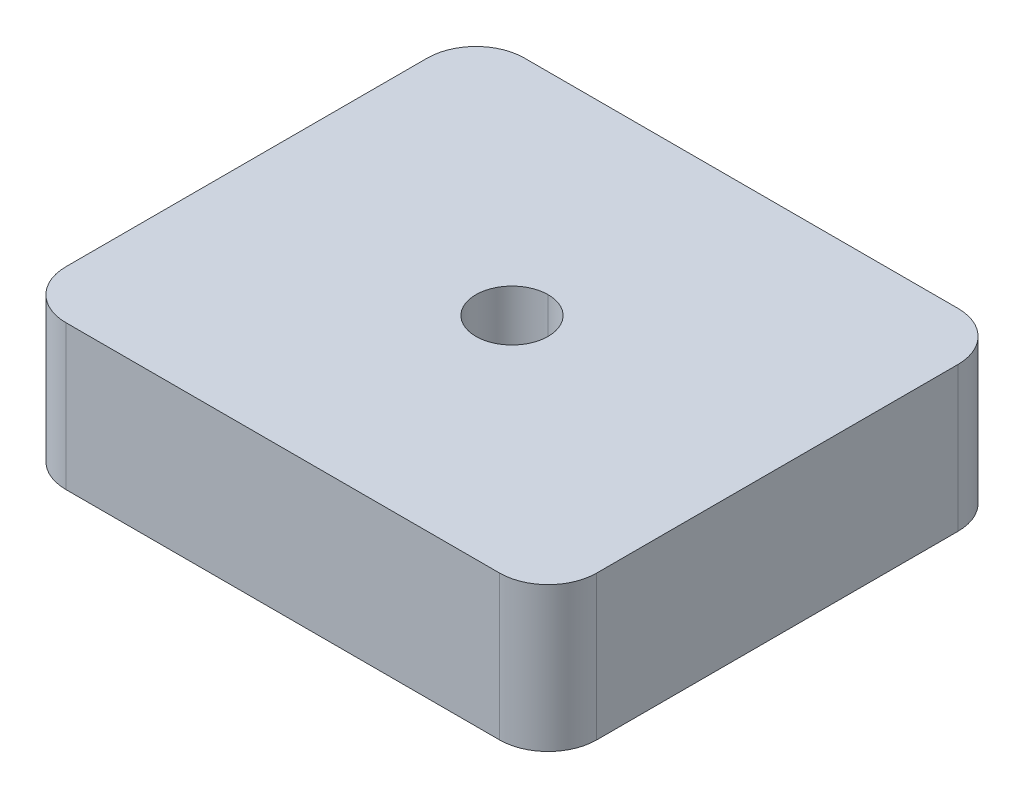
ISO-10303-21;
HEADER;
FILE_DESCRIPTION(('STEP AP214'),'2;1');
FILE_NAME('part.step','',(''),(''),'','','');
FILE_SCHEMA(('AUTOMOTIVE_DESIGN { 1 0 10303 214 1 1 1 1 }'));
ENDSEC;
DATA;
#1=APPLICATION_CONTEXT('core data for automotive mechanical design processes');
#2=APPLICATION_PROTOCOL_DEFINITION('international standard','automotive_design',2000,#1);
#3=PRODUCT_CONTEXT('',#1,'mechanical');
#4=PRODUCT('Part','Part','',(#3));
#5=PRODUCT_RELATED_PRODUCT_CATEGORY('part','',(#4));
#6=PRODUCT_DEFINITION_FORMATION('','',#4);
#7=PRODUCT_DEFINITION_CONTEXT('part definition',#1,'design');
#8=PRODUCT_DEFINITION('design','',#6,#7);
#9=PRODUCT_DEFINITION_SHAPE('','',#8);
#10=(LENGTH_UNIT() NAMED_UNIT(*) SI_UNIT(.MILLI.,.METRE.));
#11=(NAMED_UNIT(*) PLANE_ANGLE_UNIT() SI_UNIT($,.RADIAN.));
#12=(NAMED_UNIT(*) SI_UNIT($,.STERADIAN.) SOLID_ANGLE_UNIT());
#13=UNCERTAINTY_MEASURE_WITH_UNIT(LENGTH_MEASURE(1.E-05),#10,'distance_accuracy_value','');
#14=(GEOMETRIC_REPRESENTATION_CONTEXT(3) GLOBAL_UNCERTAINTY_ASSIGNED_CONTEXT((#13)) GLOBAL_UNIT_ASSIGNED_CONTEXT((#10,
#11,#12)) REPRESENTATION_CONTEXT('',''));
#15=CARTESIAN_POINT('',(0.,0.,0.));
#16=DIRECTION('',(0.,0.,1.));
#17=DIRECTION('',(1.,0.,0.));
#18=AXIS2_PLACEMENT_3D('',#15,#16,#17);
#19=CARTESIAN_POINT('',(0.,15.,0.));
#20=DIRECTION('',(0.,1.,0.));
#21=DIRECTION('',(0.,0.,1.));
#22=AXIS2_PLACEMENT_3D('',#19,#20,#21);
#23=CYLINDRICAL_SURFACE('',#22,3.5);
#24=CARTESIAN_POINT('',(0.,3.,0.));
#25=DIRECTION('',(0.,1.,0.));
#26=DIRECTION('',(0.,0.,1.));
#27=AXIS2_PLACEMENT_3D('',#24,#25,#26);
#28=CIRCLE('',#27,3.5);
#29=CARTESIAN_POINT('',(0.,3.,-3.5));
#30=VERTEX_POINT('',#29);
#31=CARTESIAN_POINT('',(0.,3.,3.5));
#32=VERTEX_POINT('',#31);
#33=EDGE_CURVE('E41',#30,#32,#28,.T.);
#34=ORIENTED_EDGE('',*,*,#33,.F.);
#35=DIRECTION('',(0.,1.,0.));
#36=VECTOR('',#35,1.);
#37=CARTESIAN_POINT('',(0.,15.,-3.5));
#38=LINE('',#37,#36);
#39=CARTESIAN_POINT('',(0.,15.,-3.5));
#40=VERTEX_POINT('',#39);
#41=EDGE_CURVE('E11',#30,#40,#38,.T.);
#42=ORIENTED_EDGE('',*,*,#41,.T.);
#43=CARTESIAN_POINT('',(0.,15.,0.));
#44=DIRECTION('',(0.,1.,0.));
#45=DIRECTION('',(0.,0.,1.));
#46=AXIS2_PLACEMENT_3D('',#43,#44,#45);
#47=CIRCLE('',#46,3.5);
#48=CARTESIAN_POINT('',(0.,15.,3.5));
#49=VERTEX_POINT('',#48);
#50=EDGE_CURVE('E27',#40,#49,#47,.T.);
#51=ORIENTED_EDGE('',*,*,#50,.T.);
#52=DIRECTION('',(0.,1.,0.));
#53=VECTOR('',#52,1.);
#54=CARTESIAN_POINT('',(0.,15.,3.5));
#55=LINE('',#54,#53);
#56=EDGE_CURVE('E210',#32,#49,#55,.T.);
#57=ORIENTED_EDGE('',*,*,#56,.F.);
#58=EDGE_LOOP('',(#34,#42,#51,#57));
#59=FACE_BOUND('',#58,.T.);
#60=ADVANCED_FACE('F16',(#59),#23,.F.);
#61=CARTESIAN_POINT('',(21.,15.,-17.5));
#62=DIRECTION('',(0.,-1.,0.));
#63=DIRECTION('',(0.,0.,-1.));
#64=AXIS2_PLACEMENT_3D('',#61,#62,#63);
#65=CYLINDRICAL_SURFACE('',#64,4.7);
#66=DIRECTION('',(0.,-1.,0.));
#67=VECTOR('',#66,1.);
#68=CARTESIAN_POINT('',(25.7,15.,-17.5));
#69=LINE('',#68,#67);
#70=CARTESIAN_POINT('',(25.7,15.,-17.5));
#71=VERTEX_POINT('',#70);
#72=CARTESIAN_POINT('',(25.7,1.,-17.5));
#73=VERTEX_POINT('',#72);
#74=EDGE_CURVE('E253',#71,#73,#69,.T.);
#75=ORIENTED_EDGE('',*,*,#74,.T.);
#76=CARTESIAN_POINT('',(21.,1.,-17.5));
#77=DIRECTION('',(0.,1.,0.));
#78=DIRECTION('',(0.,0.,1.));
#79=AXIS2_PLACEMENT_3D('',#76,#77,#78);
#80=CIRCLE('',#79,4.7);
#81=CARTESIAN_POINT('',(21.,1.,-22.2));
#82=VERTEX_POINT('',#81);
#83=EDGE_CURVE('E249',#73,#82,#80,.T.);
#84=ORIENTED_EDGE('',*,*,#83,.T.);
#85=DIRECTION('',(0.,-1.,0.));
#86=VECTOR('',#85,1.);
#87=CARTESIAN_POINT('',(21.,15.,-22.2));
#88=LINE('',#87,#86);
#89=CARTESIAN_POINT('',(21.,15.,-22.2));
#90=VERTEX_POINT('',#89);
#91=EDGE_CURVE('E254',#90,#82,#88,.T.);
#92=ORIENTED_EDGE('',*,*,#91,.F.);
#93=CARTESIAN_POINT('',(21.,15.,-17.5));
#94=DIRECTION('',(0.,1.,0.));
#95=DIRECTION('',(0.,0.,1.));
#96=AXIS2_PLACEMENT_3D('',#93,#94,#95);
#97=CIRCLE('',#96,4.7);
#98=EDGE_CURVE('E61',#71,#90,#97,.T.);
#99=ORIENTED_EDGE('',*,*,#98,.F.);
#100=EDGE_LOOP('',(#75,#84,#92,#99));
#101=FACE_BOUND('',#100,.T.);
#102=ADVANCED_FACE('F373',(#101),#65,.T.);
#103=CARTESIAN_POINT('',(21.,15.,-22.2));
#104=DIRECTION('',(0.,0.,1.));
#105=DIRECTION('',(1.,0.,0.));
#106=AXIS2_PLACEMENT_3D('',#103,#104,#105);
#107=PLANE('',#106);
#108=ORIENTED_EDGE('',*,*,#91,.T.);
#109=DIRECTION('',(-1.,0.,0.));
#110=VECTOR('',#109,1.);
#111=CARTESIAN_POINT('',(21.,1.,-22.2));
#112=LINE('',#111,#110);
#113=CARTESIAN_POINT('',(-21.,1.,-22.2));
#114=VERTEX_POINT('',#113);
#115=EDGE_CURVE('E283',#82,#114,#112,.T.);
#116=ORIENTED_EDGE('',*,*,#115,.T.);
#117=DIRECTION('',(0.,-1.,0.));
#118=VECTOR('',#117,1.);
#119=CARTESIAN_POINT('',(-21.,15.,-22.2));
#120=LINE('',#119,#118);
#121=CARTESIAN_POINT('',(-21.,15.,-22.2));
#122=VERTEX_POINT('',#121);
#123=EDGE_CURVE('E287',#122,#114,#120,.T.);
#124=ORIENTED_EDGE('',*,*,#123,.F.);
#125=DIRECTION('',(-1.,0.,0.));
#126=VECTOR('',#125,1.);
#127=CARTESIAN_POINT('',(21.,15.,-22.2));
#128=LINE('',#127,#126);
#129=EDGE_CURVE('E258',#90,#122,#128,.T.);
#130=ORIENTED_EDGE('',*,*,#129,.F.);
#131=EDGE_LOOP('',(#108,#116,#124,#130));
#132=FACE_BOUND('',#131,.T.);
#133=ADVANCED_FACE('F333',(#132),#107,.F.);
#134=CARTESIAN_POINT('',(-21.,15.,-17.5));
#135=DIRECTION('',(0.,-1.,0.));
#136=DIRECTION('',(0.,0.,-1.));
#137=AXIS2_PLACEMENT_3D('',#134,#135,#136);
#138=CYLINDRICAL_SURFACE('',#137,4.7);
#139=ORIENTED_EDGE('',*,*,#123,.T.);
#140=CARTESIAN_POINT('',(-21.,1.,-17.5));
#141=DIRECTION('',(0.,1.,0.));
#142=DIRECTION('',(0.,0.,1.));
#143=AXIS2_PLACEMENT_3D('',#140,#141,#142);
#144=CIRCLE('',#143,4.7);
#145=CARTESIAN_POINT('',(-25.7,1.,-17.5));
#146=VERTEX_POINT('',#145);
#147=EDGE_CURVE('E207',#114,#146,#144,.T.);
#148=ORIENTED_EDGE('',*,*,#147,.T.);
#149=DIRECTION('',(0.,-1.,0.));
#150=VECTOR('',#149,1.);
#151=CARTESIAN_POINT('',(-25.7,15.,-17.5));
#152=LINE('',#151,#150);
#153=CARTESIAN_POINT('',(-25.7,15.,-17.5));
#154=VERTEX_POINT('',#153);
#155=EDGE_CURVE('E205',#154,#146,#152,.T.);
#156=ORIENTED_EDGE('',*,*,#155,.F.);
#157=CARTESIAN_POINT('',(-21.,15.,-17.5));
#158=DIRECTION('',(0.,1.,0.));
#159=DIRECTION('',(0.,0.,1.));
#160=AXIS2_PLACEMENT_3D('',#157,#158,#159);
#161=CIRCLE('',#160,4.7);
#162=EDGE_CURVE('E255',#122,#154,#161,.T.);
#163=ORIENTED_EDGE('',*,*,#162,.F.);
#164=EDGE_LOOP('',(#139,#148,#156,#163));
#165=FACE_BOUND('',#164,.T.);
#166=ADVANCED_FACE('F18',(#165),#138,.T.);
#167=CARTESIAN_POINT('',(-25.7,15.,-17.5));
#168=DIRECTION('',(1.,0.,0.));
#169=DIRECTION('',(0.,1.,0.));
#170=AXIS2_PLACEMENT_3D('',#167,#168,#169);
#171=PLANE('',#170);
#172=ORIENTED_EDGE('',*,*,#155,.T.);
#173=DIRECTION('',(0.,0.,1.));
#174=VECTOR('',#173,1.);
#175=CARTESIAN_POINT('',(-25.7,1.,-17.5));
#176=LINE('',#175,#174);
#177=CARTESIAN_POINT('',(-25.7,1.,17.5));
#178=VERTEX_POINT('',#177);
#179=EDGE_CURVE('E185',#146,#178,#176,.T.);
#180=ORIENTED_EDGE('',*,*,#179,.T.);
#181=DIRECTION('',(0.,-1.,0.));
#182=VECTOR('',#181,1.);
#183=CARTESIAN_POINT('',(-25.7,15.,17.5));
#184=LINE('',#183,#182);
#185=CARTESIAN_POINT('',(-25.7,15.,17.5));
#186=VERTEX_POINT('',#185);
#187=EDGE_CURVE('E222',#186,#178,#184,.T.);
#188=ORIENTED_EDGE('',*,*,#187,.F.);
#189=DIRECTION('',(0.,0.,1.));
#190=VECTOR('',#189,1.);
#191=CARTESIAN_POINT('',(-25.7,15.,-17.5));
#192=LINE('',#191,#190);
#193=EDGE_CURVE('E259',#154,#186,#192,.T.);
#194=ORIENTED_EDGE('',*,*,#193,.F.);
#195=EDGE_LOOP('',(#172,#180,#188,#194));
#196=FACE_BOUND('',#195,.T.);
#197=ADVANCED_FACE('F323',(#196),#171,.F.);
#198=CARTESIAN_POINT('',(-21.,15.,17.5));
#199=DIRECTION('',(0.,-1.,0.));
#200=DIRECTION('',(0.,0.,-1.));
#201=AXIS2_PLACEMENT_3D('',#198,#199,#200);
#202=CYLINDRICAL_SURFACE('',#201,4.7);
#203=ORIENTED_EDGE('',*,*,#187,.T.);
#204=CARTESIAN_POINT('',(-21.,1.,17.5));
#205=DIRECTION('',(0.,1.,0.));
#206=DIRECTION('',(0.,0.,1.));
#207=AXIS2_PLACEMENT_3D('',#204,#205,#206);
#208=CIRCLE('',#207,4.7);
#209=CARTESIAN_POINT('',(-21.,1.,22.2));
#210=VERTEX_POINT('',#209);
#211=EDGE_CURVE('E226',#178,#210,#208,.T.);
#212=ORIENTED_EDGE('',*,*,#211,.T.);
#213=DIRECTION('',(0.,-1.,0.));
#214=VECTOR('',#213,1.);
#215=CARTESIAN_POINT('',(-21.,15.,22.2));
#216=LINE('',#215,#214);
#217=CARTESIAN_POINT('',(-21.,15.,22.2));
#218=VERTEX_POINT('',#217);
#219=EDGE_CURVE('E237',#218,#210,#216,.T.);
#220=ORIENTED_EDGE('',*,*,#219,.F.);
#221=CARTESIAN_POINT('',(-21.,15.,17.5));
#222=DIRECTION('',(0.,1.,0.));
#223=DIRECTION('',(0.,0.,1.));
#224=AXIS2_PLACEMENT_3D('',#221,#222,#223);
#225=CIRCLE('',#224,4.7);
#226=EDGE_CURVE('E267',#186,#218,#225,.T.);
#227=ORIENTED_EDGE('',*,*,#226,.F.);
#228=EDGE_LOOP('',(#203,#212,#220,#227));
#229=FACE_BOUND('',#228,.T.);
#230=ADVANCED_FACE('F320',(#229),#202,.T.);
#231=CARTESIAN_POINT('',(-21.,15.,22.2));
#232=DIRECTION('',(0.,0.,-1.));
#233=DIRECTION('',(0.,-1.,0.));
#234=AXIS2_PLACEMENT_3D('',#231,#232,#233);
#235=PLANE('',#234);
#236=ORIENTED_EDGE('',*,*,#219,.T.);
#237=DIRECTION('',(1.,0.,0.));
#238=VECTOR('',#237,1.);
#239=CARTESIAN_POINT('',(-21.,1.,22.2));
#240=LINE('',#239,#238);
#241=CARTESIAN_POINT('',(21.,1.,22.2));
#242=VERTEX_POINT('',#241);
#243=EDGE_CURVE('E233',#210,#242,#240,.T.);
#244=ORIENTED_EDGE('',*,*,#243,.T.);
#245=DIRECTION('',(0.,-1.,0.));
#246=VECTOR('',#245,1.);
#247=CARTESIAN_POINT('',(21.,15.,22.2));
#248=LINE('',#247,#246);
#249=CARTESIAN_POINT('',(21.,15.,22.2));
#250=VERTEX_POINT('',#249);
#251=EDGE_CURVE('E231',#250,#242,#248,.T.);
#252=ORIENTED_EDGE('',*,*,#251,.F.);
#253=DIRECTION('',(1.,0.,0.));
#254=VECTOR('',#253,1.);
#255=CARTESIAN_POINT('',(-21.,15.,22.2));
#256=LINE('',#255,#254);
#257=EDGE_CURVE('E269',#218,#250,#256,.T.);
#258=ORIENTED_EDGE('',*,*,#257,.F.);
#259=EDGE_LOOP('',(#236,#244,#252,#258));
#260=FACE_BOUND('',#259,.T.);
#261=ADVANCED_FACE('F413',(#260),#235,.F.);
#262=CARTESIAN_POINT('',(21.,15.,17.5));
#263=DIRECTION('',(0.,-1.,0.));
#264=DIRECTION('',(0.,0.,-1.));
#265=AXIS2_PLACEMENT_3D('',#262,#263,#264);
#266=CYLINDRICAL_SURFACE('',#265,4.7);
#267=ORIENTED_EDGE('',*,*,#251,.T.);
#268=CARTESIAN_POINT('',(21.,1.,17.5));
#269=DIRECTION('',(0.,1.,0.));
#270=DIRECTION('',(0.,0.,1.));
#271=AXIS2_PLACEMENT_3D('',#268,#269,#270);
#272=CIRCLE('',#271,4.7);
#273=CARTESIAN_POINT('',(25.7,1.,17.5));
#274=VERTEX_POINT('',#273);
#275=EDGE_CURVE('E227',#242,#274,#272,.T.);
#276=ORIENTED_EDGE('',*,*,#275,.T.);
#277=DIRECTION('',(0.,-1.,0.));
#278=VECTOR('',#277,1.);
#279=CARTESIAN_POINT('',(25.7,15.,17.5));
#280=LINE('',#279,#278);
#281=CARTESIAN_POINT('',(25.7,15.,17.5));
#282=VERTEX_POINT('',#281);
#283=EDGE_CURVE('E232',#282,#274,#280,.T.);
#284=ORIENTED_EDGE('',*,*,#283,.F.);
#285=CARTESIAN_POINT('',(21.,15.,17.5));
#286=DIRECTION('',(0.,1.,0.));
#287=DIRECTION('',(0.,0.,1.));
#288=AXIS2_PLACEMENT_3D('',#285,#286,#287);
#289=CIRCLE('',#288,4.7);
#290=EDGE_CURVE('E218',#250,#282,#289,.T.);
#291=ORIENTED_EDGE('',*,*,#290,.F.);
#292=EDGE_LOOP('',(#267,#276,#284,#291));
#293=FACE_BOUND('',#292,.T.);
#294=ADVANCED_FACE('F409',(#293),#266,.T.);
#295=CARTESIAN_POINT('',(25.7,15.,17.5));
#296=DIRECTION('',(-1.,0.,0.));
#297=DIRECTION('',(0.,1.,0.));
#298=AXIS2_PLACEMENT_3D('',#295,#296,#297);
#299=PLANE('',#298);
#300=ORIENTED_EDGE('',*,*,#283,.T.);
#301=DIRECTION('',(0.,0.,-1.));
#302=VECTOR('',#301,1.);
#303=CARTESIAN_POINT('',(25.7,1.,17.5));
#304=LINE('',#303,#302);
#305=EDGE_CURVE('E203',#274,#73,#304,.T.);
#306=ORIENTED_EDGE('',*,*,#305,.T.);
#307=ORIENTED_EDGE('',*,*,#74,.F.);
#308=DIRECTION('',(0.,0.,-1.));
#309=VECTOR('',#308,1.);
#310=CARTESIAN_POINT('',(25.7,15.,17.5));
#311=LINE('',#310,#309);
#312=EDGE_CURVE('E180',#282,#71,#311,.T.);
#313=ORIENTED_EDGE('',*,*,#312,.F.);
#314=EDGE_LOOP('',(#300,#306,#307,#313));
#315=FACE_BOUND('',#314,.T.);
#316=ADVANCED_FACE('F406',(#315),#299,.F.);
#317=CARTESIAN_POINT('',(21.,15.,-17.5));
#318=DIRECTION('',(0.,1.,0.));
#319=DIRECTION('',(1.,0.,0.));
#320=AXIS2_PLACEMENT_3D('',#317,#318,#319);
#321=PLANE('',#320);
#322=ORIENTED_EDGE('',*,*,#98,.T.);
#323=ORIENTED_EDGE('',*,*,#129,.T.);
#324=ORIENTED_EDGE('',*,*,#162,.T.);
#325=ORIENTED_EDGE('',*,*,#193,.T.);
#326=ORIENTED_EDGE('',*,*,#226,.T.);
#327=ORIENTED_EDGE('',*,*,#257,.T.);
#328=ORIENTED_EDGE('',*,*,#290,.T.);
#329=ORIENTED_EDGE('',*,*,#312,.T.);
#330=EDGE_LOOP('',(#322,#323,#324,#325,#326,#327,#328,#329));
#331=FACE_BOUND('',#330,.T.);
#332=CARTESIAN_POINT('',(0.,15.,0.));
#333=DIRECTION('',(0.,1.,0.));
#334=DIRECTION('',(0.,0.,1.));
#335=AXIS2_PLACEMENT_3D('',#332,#333,#334);
#336=CIRCLE('',#335,3.5);
#337=EDGE_CURVE('E243',#49,#40,#336,.T.);
#338=ORIENTED_EDGE('',*,*,#337,.F.);
#339=ORIENTED_EDGE('',*,*,#50,.F.);
#340=EDGE_LOOP('',(#338,#339));
#341=FACE_BOUND('',#340,.T.);
#342=ADVANCED_FACE('F355',(#331,#341),#321,.T.);
#343=CARTESIAN_POINT('',(21.,0.,-17.5));
#344=DIRECTION('',(0.,1.,0.));
#345=DIRECTION('',(1.,0.,0.));
#346=AXIS2_PLACEMENT_3D('',#343,#344,#345);
#347=PLANE('',#346);
#348=CARTESIAN_POINT('',(-21.,0.,-17.5));
#349=DIRECTION('',(0.,-1.,0.));
#350=DIRECTION('',(0.,0.,1.));
#351=AXIS2_PLACEMENT_3D('',#348,#349,#350);
#352=CIRCLE('',#351,0.699999999999954);
#353=CARTESIAN_POINT('',(-21.7,0.,-17.5));
#354=VERTEX_POINT('',#353);
#355=CARTESIAN_POINT('',(-21.,0.,-18.2));
#356=VERTEX_POINT('',#355);
#357=EDGE_CURVE('E162',#354,#356,#352,.T.);
#358=ORIENTED_EDGE('',*,*,#357,.T.);
#359=DIRECTION('',(1.,0.,0.));
#360=VECTOR('',#359,1.);
#361=CARTESIAN_POINT('',(21.,0.,-18.2));
#362=LINE('',#361,#360);
#363=CARTESIAN_POINT('',(21.,0.,-18.2));
#364=VERTEX_POINT('',#363);
#365=EDGE_CURVE('E181',#356,#364,#362,.T.);
#366=ORIENTED_EDGE('',*,*,#365,.T.);
#367=CARTESIAN_POINT('',(21.,0.,-17.5));
#368=DIRECTION('',(0.,-1.,0.));
#369=DIRECTION('',(0.,0.,1.));
#370=AXIS2_PLACEMENT_3D('',#367,#368,#369);
#371=CIRCLE('',#370,0.699999999999951);
#372=CARTESIAN_POINT('',(21.7,0.,-17.5));
#373=VERTEX_POINT('',#372);
#374=EDGE_CURVE('E20',#364,#373,#371,.T.);
#375=ORIENTED_EDGE('',*,*,#374,.T.);
#376=DIRECTION('',(0.,0.,1.));
#377=VECTOR('',#376,1.);
#378=CARTESIAN_POINT('',(21.7,0.,-17.5));
#379=LINE('',#378,#377);
#380=CARTESIAN_POINT('',(21.7,0.,17.5));
#381=VERTEX_POINT('',#380);
#382=EDGE_CURVE('E211',#373,#381,#379,.T.);
#383=ORIENTED_EDGE('',*,*,#382,.T.);
#384=CARTESIAN_POINT('',(21.,0.,17.5));
#385=DIRECTION('',(0.,-1.,0.));
#386=DIRECTION('',(0.,0.,1.));
#387=AXIS2_PLACEMENT_3D('',#384,#385,#386);
#388=CIRCLE('',#387,0.699999999999954);
#389=CARTESIAN_POINT('',(21.,0.,18.2));
#390=VERTEX_POINT('',#389);
#391=EDGE_CURVE('E215',#381,#390,#388,.T.);
#392=ORIENTED_EDGE('',*,*,#391,.T.);
#393=DIRECTION('',(-1.,0.,0.));
#394=VECTOR('',#393,1.);
#395=CARTESIAN_POINT('',(21.,0.,18.2));
#396=LINE('',#395,#394);
#397=CARTESIAN_POINT('',(-21.,0.,18.2));
#398=VERTEX_POINT('',#397);
#399=EDGE_CURVE('E219',#390,#398,#396,.T.);
#400=ORIENTED_EDGE('',*,*,#399,.T.);
#401=CARTESIAN_POINT('',(-21.,0.,17.5));
#402=DIRECTION('',(0.,-1.,0.));
#403=DIRECTION('',(0.,0.,1.));
#404=AXIS2_PLACEMENT_3D('',#401,#402,#403);
#405=CIRCLE('',#404,0.699999999999954);
#406=CARTESIAN_POINT('',(-21.7,0.,17.5));
#407=VERTEX_POINT('',#406);
#408=EDGE_CURVE('E165',#398,#407,#405,.T.);
#409=ORIENTED_EDGE('',*,*,#408,.T.);
#410=DIRECTION('',(0.,0.,-1.));
#411=VECTOR('',#410,1.);
#412=CARTESIAN_POINT('',(-21.7,0.,-17.5));
#413=LINE('',#412,#411);
#414=EDGE_CURVE('E158',#407,#354,#413,.T.);
#415=ORIENTED_EDGE('',*,*,#414,.T.);
#416=EDGE_LOOP('',(#358,#366,#375,#383,#392,#400,#409,#415));
#417=FACE_BOUND('',#416,.T.);
#418=ADVANCED_FACE('F160',(#417),#347,.F.);
#419=CARTESIAN_POINT('',(0.,3.,0.));
#420=DIRECTION('',(0.,-1.,0.));
#421=DIRECTION('',(0.,0.,-1.));
#422=AXIS2_PLACEMENT_3D('',#419,#420,#421);
#423=PLANE('',#422);
#424=CARTESIAN_POINT('',(0.,3.,0.));
#425=DIRECTION('',(0.,1.,0.));
#426=DIRECTION('',(0.,0.,1.));
#427=AXIS2_PLACEMENT_3D('',#424,#425,#426);
#428=CIRCLE('',#427,3.5);
#429=EDGE_CURVE('E171',#32,#30,#428,.T.);
#430=ORIENTED_EDGE('',*,*,#429,.T.);
#431=ORIENTED_EDGE('',*,*,#33,.T.);
#432=EDGE_LOOP('',(#430,#431));
#433=FACE_BOUND('',#432,.T.);
#434=ADVANCED_FACE('F360',(#433),#423,.F.);
#435=CARTESIAN_POINT('',(0.,15.,0.));
#436=DIRECTION('',(0.,1.,0.));
#437=DIRECTION('',(0.,0.,1.));
#438=AXIS2_PLACEMENT_3D('',#435,#436,#437);
#439=CYLINDRICAL_SURFACE('',#438,3.5);
#440=ORIENTED_EDGE('',*,*,#41,.F.);
#441=ORIENTED_EDGE('',*,*,#429,.F.);
#442=ORIENTED_EDGE('',*,*,#56,.T.);
#443=ORIENTED_EDGE('',*,*,#337,.T.);
#444=EDGE_LOOP('',(#440,#441,#442,#443));
#445=FACE_BOUND('',#444,.T.);
#446=ADVANCED_FACE('F357',(#445),#439,.F.);
#447=CARTESIAN_POINT('',(-21.,1.,22.2));
#448=DIRECTION('',(0.,0.970142500145332,-0.242535625036331));
#449=DIRECTION('',(-1.,0.,0.));
#450=AXIS2_PLACEMENT_3D('',#447,#448,#449);
#451=PLANE('',#450);
#452=DIRECTION('',(0.,0.242535625036331,0.970142500145333));
#453=VECTOR('',#452,1.);
#454=CARTESIAN_POINT('',(-21.,0.,18.2));
#455=LINE('',#454,#453);
#456=EDGE_CURVE('E271',#398,#210,#455,.T.);
#457=ORIENTED_EDGE('',*,*,#456,.F.);
#458=ORIENTED_EDGE('',*,*,#399,.F.);
#459=DIRECTION('',(0.,-0.242535625036331,-0.970142500145333));
#460=VECTOR('',#459,1.);
#461=CARTESIAN_POINT('',(21.,1.,22.2));
#462=LINE('',#461,#460);
#463=EDGE_CURVE('E275',#242,#390,#462,.T.);
#464=ORIENTED_EDGE('',*,*,#463,.F.);
#465=ORIENTED_EDGE('',*,*,#243,.F.);
#466=EDGE_LOOP('',(#457,#458,#464,#465));
#467=FACE_BOUND('',#466,.T.);
#468=ADVANCED_FACE('F368',(#467),#451,.F.);
#469=CARTESIAN_POINT('',(21.,1.,17.5));
#470=DIRECTION('',(0.,1.,0.));
#471=DIRECTION('',(0.,0.,1.));
#472=AXIS2_PLACEMENT_3D('',#469,#470,#471);
#473=CONICAL_SURFACE('',#472,4.7,1.32581766366803);
#474=ORIENTED_EDGE('',*,*,#463,.T.);
#475=ORIENTED_EDGE('',*,*,#391,.F.);
#476=DIRECTION('',(-0.970142500145333,-0.24253562503633,0.));
#477=VECTOR('',#476,1.);
#478=CARTESIAN_POINT('',(25.7,1.,17.5));
#479=LINE('',#478,#477);
#480=EDGE_CURVE('E276',#274,#381,#479,.T.);
#481=ORIENTED_EDGE('',*,*,#480,.F.);
#482=ORIENTED_EDGE('',*,*,#275,.F.);
#483=EDGE_LOOP('',(#474,#475,#481,#482));
#484=FACE_BOUND('',#483,.T.);
#485=ADVANCED_FACE('F391',(#484),#473,.T.);
#486=CARTESIAN_POINT('',(-21.,1.,17.5));
#487=DIRECTION('',(0.,1.,0.));
#488=DIRECTION('',(0.,0.,1.));
#489=AXIS2_PLACEMENT_3D('',#486,#487,#488);
#490=CONICAL_SURFACE('',#489,4.7,1.32581766366803);
#491=ORIENTED_EDGE('',*,*,#456,.T.);
#492=ORIENTED_EDGE('',*,*,#211,.F.);
#493=DIRECTION('',(-0.970142500145333,0.24253562503633,0.));
#494=VECTOR('',#493,1.);
#495=CARTESIAN_POINT('',(-21.7,0.,17.5));
#496=LINE('',#495,#494);
#497=EDGE_CURVE('E197',#407,#178,#496,.T.);
#498=ORIENTED_EDGE('',*,*,#497,.F.);
#499=ORIENTED_EDGE('',*,*,#408,.F.);
#500=EDGE_LOOP('',(#491,#492,#498,#499));
#501=FACE_BOUND('',#500,.T.);
#502=ADVANCED_FACE('F314',(#501),#490,.T.);
#503=CARTESIAN_POINT('',(25.7,1.,17.5));
#504=DIRECTION('',(-0.24253562503633,0.970142500145332,0.));
#505=DIRECTION('',(0.,0.,1.));
#506=AXIS2_PLACEMENT_3D('',#503,#504,#505);
#507=PLANE('',#506);
#508=ORIENTED_EDGE('',*,*,#480,.T.);
#509=ORIENTED_EDGE('',*,*,#382,.F.);
#510=DIRECTION('',(-0.970142500145333,-0.24253562503633,0.));
#511=VECTOR('',#510,1.);
#512=CARTESIAN_POINT('',(25.7,1.,-17.5));
#513=LINE('',#512,#511);
#514=EDGE_CURVE('E188',#73,#373,#513,.T.);
#515=ORIENTED_EDGE('',*,*,#514,.F.);
#516=ORIENTED_EDGE('',*,*,#305,.F.);
#517=EDGE_LOOP('',(#508,#509,#515,#516));
#518=FACE_BOUND('',#517,.T.);
#519=ADVANCED_FACE('F379',(#518),#507,.F.);
#520=CARTESIAN_POINT('',(-25.7,1.,-17.5));
#521=DIRECTION('',(0.24253562503633,0.970142500145332,0.));
#522=DIRECTION('',(0.,0.,-1.));
#523=AXIS2_PLACEMENT_3D('',#520,#521,#522);
#524=PLANE('',#523);
#525=ORIENTED_EDGE('',*,*,#497,.T.);
#526=ORIENTED_EDGE('',*,*,#179,.F.);
#527=DIRECTION('',(-0.970142500145333,0.24253562503633,0.));
#528=VECTOR('',#527,1.);
#529=CARTESIAN_POINT('',(-21.7,0.,-17.5));
#530=LINE('',#529,#528);
#531=EDGE_CURVE('E176',#354,#146,#530,.T.);
#532=ORIENTED_EDGE('',*,*,#531,.F.);
#533=ORIENTED_EDGE('',*,*,#414,.F.);
#534=EDGE_LOOP('',(#525,#526,#532,#533));
#535=FACE_BOUND('',#534,.T.);
#536=ADVANCED_FACE('F183',(#535),#524,.F.);
#537=CARTESIAN_POINT('',(21.,1.,-17.5));
#538=DIRECTION('',(0.,1.,0.));
#539=DIRECTION('',(0.,0.,1.));
#540=AXIS2_PLACEMENT_3D('',#537,#538,#539);
#541=CONICAL_SURFACE('',#540,4.7,1.32581766366803);
#542=ORIENTED_EDGE('',*,*,#514,.T.);
#543=ORIENTED_EDGE('',*,*,#374,.F.);
#544=DIRECTION('',(0.,-0.24253562503633,0.970142500145333));
#545=VECTOR('',#544,1.);
#546=CARTESIAN_POINT('',(21.,1.,-22.2));
#547=LINE('',#546,#545);
#548=EDGE_CURVE('E189',#82,#364,#547,.T.);
#549=ORIENTED_EDGE('',*,*,#548,.F.);
#550=ORIENTED_EDGE('',*,*,#83,.F.);
#551=EDGE_LOOP('',(#542,#543,#549,#550));
#552=FACE_BOUND('',#551,.T.);
#553=ADVANCED_FACE('F387',(#552),#541,.T.);
#554=CARTESIAN_POINT('',(-21.,1.,-17.5));
#555=DIRECTION('',(0.,1.,0.));
#556=DIRECTION('',(0.,0.,1.));
#557=AXIS2_PLACEMENT_3D('',#554,#555,#556);
#558=CONICAL_SURFACE('',#557,4.7,1.32581766366803);
#559=ORIENTED_EDGE('',*,*,#531,.T.);
#560=ORIENTED_EDGE('',*,*,#147,.F.);
#561=DIRECTION('',(0.,0.24253562503633,-0.970142500145333));
#562=VECTOR('',#561,1.);
#563=CARTESIAN_POINT('',(-21.,0.,-18.2));
#564=LINE('',#563,#562);
#565=EDGE_CURVE('E178',#356,#114,#564,.T.);
#566=ORIENTED_EDGE('',*,*,#565,.F.);
#567=ORIENTED_EDGE('',*,*,#357,.F.);
#568=EDGE_LOOP('',(#559,#560,#566,#567));
#569=FACE_BOUND('',#568,.T.);
#570=ADVANCED_FACE('F175',(#569),#558,.T.);
#571=CARTESIAN_POINT('',(21.,1.,-22.2));
#572=DIRECTION('',(0.,0.970142500145332,0.24253562503633));
#573=DIRECTION('',(1.,0.,0.));
#574=AXIS2_PLACEMENT_3D('',#571,#572,#573);
#575=PLANE('',#574);
#576=ORIENTED_EDGE('',*,*,#548,.T.);
#577=ORIENTED_EDGE('',*,*,#365,.F.);
#578=ORIENTED_EDGE('',*,*,#565,.T.);
#579=ORIENTED_EDGE('',*,*,#115,.F.);
#580=EDGE_LOOP('',(#576,#577,#578,#579));
#581=FACE_BOUND('',#580,.T.);
#582=ADVANCED_FACE('F336',(#581),#575,.F.);
#583=CLOSED_SHELL('',(#60,#102,#133,#166,#197,#230,#261,#294,#316,#342,#418,#434,#446,#468,#485,
#502,#519,#536,#553,#570,#582));
#584=MANIFOLD_SOLID_BREP('B1',#583);
#585=ADVANCED_BREP_SHAPE_REPRESENTATION('',(#18,#584),#14);
#586=SHAPE_DEFINITION_REPRESENTATION(#9,#585);
ENDSEC;
END-ISO-10303-21;
